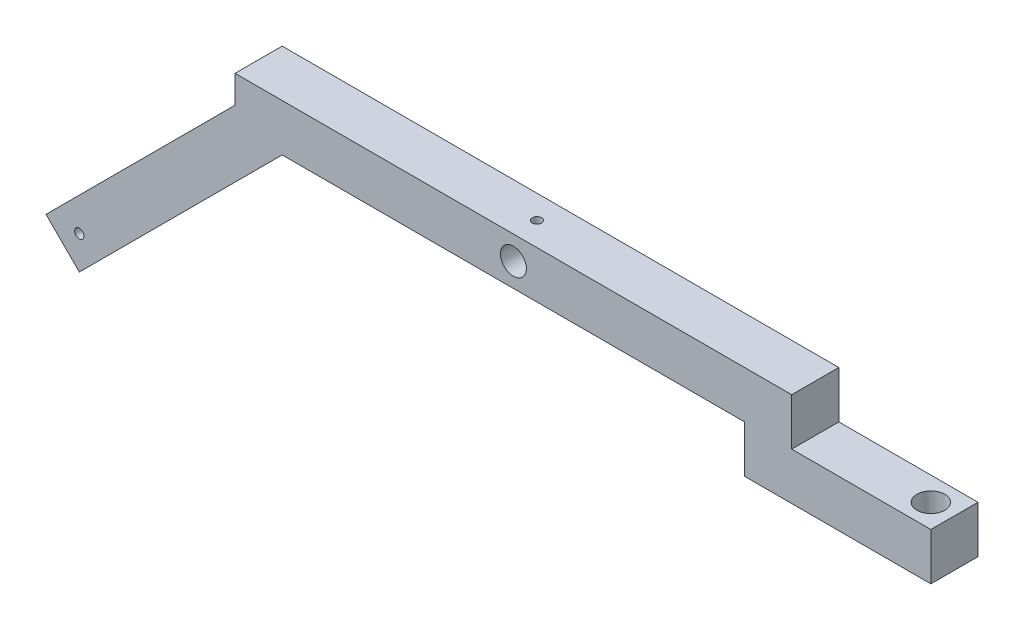
ISO-10303-21;
HEADER;
FILE_DESCRIPTION(('STEP AP214'),'2;1');
FILE_NAME('part.step','',(''),(''),'','','');
FILE_SCHEMA(('AUTOMOTIVE_DESIGN { 1 0 10303 214 1 1 1 1 }'));
ENDSEC;
DATA;
#1=APPLICATION_CONTEXT('core data for automotive mechanical design processes');
#2=APPLICATION_PROTOCOL_DEFINITION('international standard','automotive_design',2000,#1);
#3=PRODUCT_CONTEXT('',#1,'mechanical');
#4=PRODUCT('Part','Part','',(#3));
#5=PRODUCT_RELATED_PRODUCT_CATEGORY('part','',(#4));
#6=PRODUCT_DEFINITION_FORMATION('','',#4);
#7=PRODUCT_DEFINITION_CONTEXT('part definition',#1,'design');
#8=PRODUCT_DEFINITION('design','',#6,#7);
#9=PRODUCT_DEFINITION_SHAPE('','',#8);
#10=(LENGTH_UNIT() NAMED_UNIT(*) SI_UNIT(.MILLI.,.METRE.));
#11=(NAMED_UNIT(*) PLANE_ANGLE_UNIT() SI_UNIT($,.RADIAN.));
#12=(NAMED_UNIT(*) SI_UNIT($,.STERADIAN.) SOLID_ANGLE_UNIT());
#13=UNCERTAINTY_MEASURE_WITH_UNIT(LENGTH_MEASURE(1.E-05),#10,'distance_accuracy_value','');
#14=(GEOMETRIC_REPRESENTATION_CONTEXT(3) GLOBAL_UNCERTAINTY_ASSIGNED_CONTEXT((#13)) GLOBAL_UNIT_ASSIGNED_CONTEXT((#10,
#11,#12)) REPRESENTATION_CONTEXT('',''));
#15=CARTESIAN_POINT('',(0.,0.,0.));
#16=DIRECTION('',(0.,0.,1.));
#17=DIRECTION('',(1.,0.,0.));
#18=AXIS2_PLACEMENT_3D('',#15,#16,#17);
#19=CARTESIAN_POINT('',(-100.,107.7,0.));
#20=DIRECTION('',(0.,-1.,0.));
#21=DIRECTION('',(0.,0.,-1.));
#22=AXIS2_PLACEMENT_3D('',#19,#20,#21);
#23=PLANE('',#22);
#24=CARTESIAN_POINT('',(50.,107.7,152.7));
#25=DIRECTION('',(0.,1.,0.));
#26=DIRECTION('',(0.,0.,1.));
#27=AXIS2_PLACEMENT_3D('',#24,#25,#26);
#28=CIRCLE('',#27,2.5);
#29=CARTESIAN_POINT('',(50.,107.7,155.2));
#30=VERTEX_POINT('',#29);
#31=EDGE_CURVE('E219',#30,#30,#28,.T.);
#32=ORIENTED_EDGE('',*,*,#31,.T.);
#33=EDGE_LOOP('',(#32));
#34=FACE_BOUND('',#33,.T.);
#35=DIRECTION('',(1.,0.,0.));
#36=VECTOR('',#35,1.);
#37=CARTESIAN_POINT('',(-100.,107.7,140.));
#38=LINE('',#37,#36);
#39=CARTESIAN_POINT('',(-74.6,107.7,140.));
#40=VERTEX_POINT('',#39);
#41=CARTESIAN_POINT('',(174.6,107.7,140.));
#42=VERTEX_POINT('',#41);
#43=EDGE_CURVE('E256',#40,#42,#38,.T.);
#44=ORIENTED_EDGE('',*,*,#43,.T.);
#45=DIRECTION('',(0.,0.,-1.));
#46=VECTOR('',#45,1.);
#47=CARTESIAN_POINT('',(174.6,107.7,165.4));
#48=LINE('',#47,#46);
#49=CARTESIAN_POINT('',(174.6,107.7,165.4));
#50=VERTEX_POINT('',#49);
#51=EDGE_CURVE('E139',#50,#42,#48,.T.);
#52=ORIENTED_EDGE('',*,*,#51,.F.);
#53=DIRECTION('',(1.,0.,0.));
#54=VECTOR('',#53,1.);
#55=CARTESIAN_POINT('',(-100.,107.7,165.4));
#56=LINE('',#55,#54);
#57=CARTESIAN_POINT('',(-74.6,107.7,165.4));
#58=VERTEX_POINT('',#57);
#59=EDGE_CURVE('E51',#58,#50,#56,.T.);
#60=ORIENTED_EDGE('',*,*,#59,.F.);
#61=DIRECTION('',(0.,0.,1.));
#62=VECTOR('',#61,1.);
#63=CARTESIAN_POINT('',(-74.6,107.7,140.));
#64=LINE('',#63,#62);
#65=EDGE_CURVE('E190',#40,#58,#64,.T.);
#66=ORIENTED_EDGE('',*,*,#65,.F.);
#67=EDGE_LOOP('',(#44,#52,#60,#66));
#68=FACE_BOUND('',#67,.T.);
#69=ADVANCED_FACE('F42',(#34,#68),#23,.T.);
#70=CARTESIAN_POINT('',(-100.,0.,0.));
#71=DIRECTION('',(1.,0.,0.));
#72=DIRECTION('',(0.,0.,-1.));
#73=AXIS2_PLACEMENT_3D('',#70,#71,#72);
#74=PLANE('',#73);
#75=DIRECTION('',(0.,0.,-1.));
#76=VECTOR('',#75,1.);
#77=CARTESIAN_POINT('',(-100.,118.221024484276,0.));
#78=LINE('',#77,#76);
#79=CARTESIAN_POINT('',(-100.,118.221024484276,165.4));
#80=VERTEX_POINT('',#79);
#81=CARTESIAN_POINT('',(-100.,118.221024484276,140.));
#82=VERTEX_POINT('',#81);
#83=EDGE_CURVE('E11',#80,#82,#78,.T.);
#84=ORIENTED_EDGE('',*,*,#83,.F.);
#85=DIRECTION('',(0.,1.,0.));
#86=VECTOR('',#85,1.);
#87=CARTESIAN_POINT('',(-100.,0.,165.4));
#88=LINE('',#87,#86);
#89=CARTESIAN_POINT('',(-100.,133.1,165.4));
#90=VERTEX_POINT('',#89);
#91=EDGE_CURVE('E253',#80,#90,#88,.T.);
#92=ORIENTED_EDGE('',*,*,#91,.T.);
#93=DIRECTION('',(0.,0.,-1.));
#94=VECTOR('',#93,1.);
#95=CARTESIAN_POINT('',(-100.,133.1,0.));
#96=LINE('',#95,#94);
#97=CARTESIAN_POINT('',(-100.,133.1,140.));
#98=VERTEX_POINT('',#97);
#99=EDGE_CURVE('E249',#90,#98,#96,.T.);
#100=ORIENTED_EDGE('',*,*,#99,.T.);
#101=DIRECTION('',(0.,1.,0.));
#102=VECTOR('',#101,1.);
#103=CARTESIAN_POINT('',(-100.,0.,140.));
#104=LINE('',#103,#102);
#105=EDGE_CURVE('E246',#82,#98,#104,.T.);
#106=ORIENTED_EDGE('',*,*,#105,.F.);
#107=EDGE_LOOP('',(#84,#92,#100,#106));
#108=FACE_BOUND('',#107,.T.);
#109=ADVANCED_FACE('F328',(#108),#74,.F.);
#110=CARTESIAN_POINT('',(-100.,0.,165.4));
#111=DIRECTION('',(0.,0.,-1.));
#112=DIRECTION('',(-1.,0.,0.));
#113=AXIS2_PLACEMENT_3D('',#110,#111,#112);
#114=PLANE('',#113);
#115=CARTESIAN_POINT('',(-183.91870837144,16.3418038706977,165.4));
#116=DIRECTION('',(0.,0.,-1.));
#117=DIRECTION('',(-1.,0.,0.));
#118=AXIS2_PLACEMENT_3D('',#115,#116,#117);
#119=CIRCLE('',#118,2.5);
#120=CARTESIAN_POINT('',(-186.41870837144,16.3418038706977,165.4));
#121=VERTEX_POINT('',#120);
#122=EDGE_CURVE('E186',#121,#121,#119,.T.);
#123=ORIENTED_EDGE('',*,*,#122,.T.);
#124=EDGE_LOOP('',(#123));
#125=FACE_BOUND('',#124,.T.);
#126=DIRECTION('',(0.707106781186547,0.707106781186548,0.));
#127=VECTOR('',#126,1.);
#128=CARTESIAN_POINT('',(-183.91870837144,-1.61870837144028,165.4));
#129=LINE('',#128,#127);
#130=CARTESIAN_POINT('',(-183.91870837144,-1.61870837144028,165.4));
#131=VERTEX_POINT('',#130);
#132=EDGE_CURVE('E215',#131,#58,#129,.T.);
#133=ORIENTED_EDGE('',*,*,#132,.T.);
#134=ORIENTED_EDGE('',*,*,#59,.T.);
#135=DIRECTION('',(0.,1.,0.));
#136=VECTOR('',#135,1.);
#137=CARTESIAN_POINT('',(174.6,82.3,165.4));
#138=LINE('',#137,#136);
#139=CARTESIAN_POINT('',(174.6,82.3,165.4));
#140=VERTEX_POINT('',#139);
#141=EDGE_CURVE('E134',#140,#50,#138,.T.);
#142=ORIENTED_EDGE('',*,*,#141,.F.);
#143=DIRECTION('',(-1.,0.,0.));
#144=VECTOR('',#143,1.);
#145=CARTESIAN_POINT('',(200.,82.3,165.4));
#146=LINE('',#145,#144);
#147=CARTESIAN_POINT('',(275.,82.3,165.4));
#148=VERTEX_POINT('',#147);
#149=EDGE_CURVE('E126',#148,#140,#146,.T.);
#150=ORIENTED_EDGE('',*,*,#149,.F.);
#151=DIRECTION('',(0.,-1.,0.));
#152=VECTOR('',#151,1.);
#153=CARTESIAN_POINT('',(275.,82.3,165.4));
#154=LINE('',#153,#152);
#155=CARTESIAN_POINT('',(275.,107.7,165.4));
#156=VERTEX_POINT('',#155);
#157=EDGE_CURVE('E132',#156,#148,#154,.T.);
#158=ORIENTED_EDGE('',*,*,#157,.F.);
#159=DIRECTION('',(-1.,0.,0.));
#160=VECTOR('',#159,1.);
#161=CARTESIAN_POINT('',(275.,107.7,165.4));
#162=LINE('',#161,#160);
#163=CARTESIAN_POINT('',(200.,107.7,165.4));
#164=VERTEX_POINT('',#163);
#165=EDGE_CURVE('E166',#156,#164,#162,.T.);
#166=ORIENTED_EDGE('',*,*,#165,.T.);
#167=DIRECTION('',(0.,1.,0.));
#168=VECTOR('',#167,1.);
#169=CARTESIAN_POINT('',(200.,0.,165.4));
#170=LINE('',#169,#168);
#171=CARTESIAN_POINT('',(200.,133.1,165.4));
#172=VERTEX_POINT('',#171);
#173=EDGE_CURVE('E243',#164,#172,#170,.T.);
#174=ORIENTED_EDGE('',*,*,#173,.T.);
#175=DIRECTION('',(1.,0.,0.));
#176=VECTOR('',#175,1.);
#177=CARTESIAN_POINT('',(-100.,133.1,165.4));
#178=LINE('',#177,#176);
#179=EDGE_CURVE('E259',#90,#172,#178,.T.);
#180=ORIENTED_EDGE('',*,*,#179,.F.);
#181=ORIENTED_EDGE('',*,*,#91,.F.);
#182=DIRECTION('',(0.707106781186547,0.707106781186548,0.));
#183=VECTOR('',#182,1.);
#184=CARTESIAN_POINT('',(-201.879220613578,16.3418038706977,165.4));
#185=LINE('',#184,#183);
#186=CARTESIAN_POINT('',(-201.879220613578,16.3418038706977,165.4));
#187=VERTEX_POINT('',#186);
#188=EDGE_CURVE('E212',#187,#80,#185,.T.);
#189=ORIENTED_EDGE('',*,*,#188,.F.);
#190=DIRECTION('',(-0.707106781186547,0.707106781186548,0.));
#191=VECTOR('',#190,1.);
#192=CARTESIAN_POINT('',(-183.91870837144,-1.61870837144028,165.4));
#193=LINE('',#192,#191);
#194=EDGE_CURVE('E195',#131,#187,#193,.T.);
#195=ORIENTED_EDGE('',*,*,#194,.F.);
#196=EDGE_LOOP('',(#133,#134,#142,#150,#158,#166,#174,#180,#181,#189,#195));
#197=FACE_BOUND('',#196,.T.);
#198=CARTESIAN_POINT('',(49.9999999999997,120.4,165.4));
#199=DIRECTION('',(0.,0.,1.));
#200=DIRECTION('',(1.,0.,0.));
#201=AXIS2_PLACEMENT_3D('',#198,#199,#200);
#202=CIRCLE('',#201,7.);
#203=CARTESIAN_POINT('',(56.9999999999997,120.4,165.4));
#204=VERTEX_POINT('',#203);
#205=EDGE_CURVE('E227',#204,#204,#202,.T.);
#206=ORIENTED_EDGE('',*,*,#205,.F.);
#207=EDGE_LOOP('',(#206));
#208=FACE_BOUND('',#207,.T.);
#209=ADVANCED_FACE('F128',(#125,#197,#208),#114,.F.);
#210=CARTESIAN_POINT('',(-100.,133.1,0.));
#211=DIRECTION('',(0.,-1.,0.));
#212=DIRECTION('',(0.,0.,-1.));
#213=AXIS2_PLACEMENT_3D('',#210,#211,#212);
#214=PLANE('',#213);
#215=CARTESIAN_POINT('',(50.,133.1,152.7));
#216=DIRECTION('',(0.,1.,0.));
#217=DIRECTION('',(0.,0.,1.));
#218=AXIS2_PLACEMENT_3D('',#215,#216,#217);
#219=CIRCLE('',#218,2.5);
#220=CARTESIAN_POINT('',(50.,133.1,155.2));
#221=VERTEX_POINT('',#220);
#222=EDGE_CURVE('E218',#221,#221,#219,.T.);
#223=ORIENTED_EDGE('',*,*,#222,.F.);
#224=EDGE_LOOP('',(#223));
#225=FACE_BOUND('',#224,.T.);
#226=ORIENTED_EDGE('',*,*,#179,.T.);
#227=DIRECTION('',(0.,0.,-1.));
#228=VECTOR('',#227,1.);
#229=CARTESIAN_POINT('',(200.,133.1,0.));
#230=LINE('',#229,#228);
#231=CARTESIAN_POINT('',(200.,133.1,140.));
#232=VERTEX_POINT('',#231);
#233=EDGE_CURVE('E239',#172,#232,#230,.T.);
#234=ORIENTED_EDGE('',*,*,#233,.T.);
#235=DIRECTION('',(1.,0.,0.));
#236=VECTOR('',#235,1.);
#237=CARTESIAN_POINT('',(-100.,133.1,140.));
#238=LINE('',#237,#236);
#239=EDGE_CURVE('E263',#98,#232,#238,.T.);
#240=ORIENTED_EDGE('',*,*,#239,.F.);
#241=ORIENTED_EDGE('',*,*,#99,.F.);
#242=EDGE_LOOP('',(#226,#234,#240,#241));
#243=FACE_BOUND('',#242,.T.);
#244=ADVANCED_FACE('F353',(#225,#243),#214,.F.);
#245=CARTESIAN_POINT('',(-100.,0.,140.));
#246=DIRECTION('',(0.,0.,-1.));
#247=DIRECTION('',(-1.,0.,0.));
#248=AXIS2_PLACEMENT_3D('',#245,#246,#247);
#249=PLANE('',#248);
#250=CARTESIAN_POINT('',(-183.91870837144,16.3418038706977,140.));
#251=DIRECTION('',(0.,0.,-1.));
#252=DIRECTION('',(-1.,0.,0.));
#253=AXIS2_PLACEMENT_3D('',#250,#251,#252);
#254=CIRCLE('',#253,2.5);
#255=CARTESIAN_POINT('',(-186.41870837144,16.3418038706977,140.));
#256=VERTEX_POINT('',#255);
#257=EDGE_CURVE('E45',#256,#256,#254,.T.);
#258=ORIENTED_EDGE('',*,*,#257,.F.);
#259=EDGE_LOOP('',(#258));
#260=FACE_BOUND('',#259,.T.);
#261=ORIENTED_EDGE('',*,*,#43,.F.);
#262=DIRECTION('',(0.707106781186547,0.707106781186548,0.));
#263=VECTOR('',#262,1.);
#264=CARTESIAN_POINT('',(-183.91870837144,-1.61870837144028,140.));
#265=LINE('',#264,#263);
#266=CARTESIAN_POINT('',(-183.91870837144,-1.61870837144028,140.));
#267=VERTEX_POINT('',#266);
#268=EDGE_CURVE('E204',#267,#40,#265,.T.);
#269=ORIENTED_EDGE('',*,*,#268,.F.);
#270=DIRECTION('',(0.707106781186547,-0.707106781186548,0.));
#271=VECTOR('',#270,1.);
#272=CARTESIAN_POINT('',(-183.91870837144,-1.61870837144028,140.));
#273=LINE('',#272,#271);
#274=CARTESIAN_POINT('',(-201.879220613578,16.3418038706977,140.));
#275=VERTEX_POINT('',#274);
#276=EDGE_CURVE('E201',#275,#267,#273,.T.);
#277=ORIENTED_EDGE('',*,*,#276,.F.);
#278=DIRECTION('',(0.707106781186547,0.707106781186548,0.));
#279=VECTOR('',#278,1.);
#280=CARTESIAN_POINT('',(-201.879220613578,16.3418038706977,140.));
#281=LINE('',#280,#279);
#282=EDGE_CURVE('E66',#275,#82,#281,.T.);
#283=ORIENTED_EDGE('',*,*,#282,.T.);
#284=ORIENTED_EDGE('',*,*,#105,.T.);
#285=ORIENTED_EDGE('',*,*,#239,.T.);
#286=DIRECTION('',(0.,1.,0.));
#287=VECTOR('',#286,1.);
#288=CARTESIAN_POINT('',(200.,0.,140.));
#289=LINE('',#288,#287);
#290=CARTESIAN_POINT('',(200.,107.7,140.));
#291=VERTEX_POINT('',#290);
#292=EDGE_CURVE('E231',#291,#232,#289,.T.);
#293=ORIENTED_EDGE('',*,*,#292,.F.);
#294=DIRECTION('',(-1.,0.,0.));
#295=VECTOR('',#294,1.);
#296=CARTESIAN_POINT('',(275.,107.7,140.));
#297=LINE('',#296,#295);
#298=CARTESIAN_POINT('',(275.,107.7,140.));
#299=VERTEX_POINT('',#298);
#300=EDGE_CURVE('E170',#299,#291,#297,.T.);
#301=ORIENTED_EDGE('',*,*,#300,.F.);
#302=DIRECTION('',(0.,1.,0.));
#303=VECTOR('',#302,1.);
#304=CARTESIAN_POINT('',(275.,82.3,140.));
#305=LINE('',#304,#303);
#306=CARTESIAN_POINT('',(275.,82.3,140.));
#307=VERTEX_POINT('',#306);
#308=EDGE_CURVE('E149',#307,#299,#305,.T.);
#309=ORIENTED_EDGE('',*,*,#308,.F.);
#310=DIRECTION('',(1.,0.,0.));
#311=VECTOR('',#310,1.);
#312=CARTESIAN_POINT('',(200.,82.3,140.));
#313=LINE('',#312,#311);
#314=CARTESIAN_POINT('',(174.6,82.3,140.));
#315=VERTEX_POINT('',#314);
#316=EDGE_CURVE('E145',#315,#307,#313,.T.);
#317=ORIENTED_EDGE('',*,*,#316,.F.);
#318=DIRECTION('',(0.,1.,0.));
#319=VECTOR('',#318,1.);
#320=CARTESIAN_POINT('',(174.6,82.3,140.));
#321=LINE('',#320,#319);
#322=EDGE_CURVE('E178',#315,#42,#321,.T.);
#323=ORIENTED_EDGE('',*,*,#322,.T.);
#324=EDGE_LOOP('',(#261,#269,#277,#283,#284,#285,#293,#301,#309,#317,#323));
#325=FACE_BOUND('',#324,.T.);
#326=CARTESIAN_POINT('',(49.9999999999997,120.4,140.));
#327=DIRECTION('',(0.,0.,-1.));
#328=DIRECTION('',(-1.,0.,0.));
#329=AXIS2_PLACEMENT_3D('',#326,#327,#328);
#330=CIRCLE('',#329,7.);
#331=CARTESIAN_POINT('',(42.9999999999997,120.4,140.));
#332=VERTEX_POINT('',#331);
#333=EDGE_CURVE('E232',#332,#332,#330,.F.);
#334=ORIENTED_EDGE('',*,*,#333,.T.);
#335=EDGE_LOOP('',(#334));
#336=FACE_BOUND('',#335,.T.);
#337=ADVANCED_FACE('F342',(#260,#325,#336),#249,.T.);
#338=CARTESIAN_POINT('',(200.,0.,0.));
#339=DIRECTION('',(1.,0.,0.));
#340=DIRECTION('',(0.,0.,-1.));
#341=AXIS2_PLACEMENT_3D('',#338,#339,#340);
#342=PLANE('',#341);
#343=DIRECTION('',(0.,0.,1.));
#344=VECTOR('',#343,1.);
#345=CARTESIAN_POINT('',(200.,107.7,165.4));
#346=LINE('',#345,#344);
#347=EDGE_CURVE('E58',#291,#164,#346,.T.);
#348=ORIENTED_EDGE('',*,*,#347,.F.);
#349=ORIENTED_EDGE('',*,*,#292,.T.);
#350=ORIENTED_EDGE('',*,*,#233,.F.);
#351=ORIENTED_EDGE('',*,*,#173,.F.);
#352=EDGE_LOOP('',(#348,#349,#350,#351));
#353=FACE_BOUND('',#352,.T.);
#354=ADVANCED_FACE('F355',(#353),#342,.T.);
#355=CARTESIAN_POINT('',(49.9999999999997,120.4,-173.501));
#356=DIRECTION('',(0.,0.,1.));
#357=DIRECTION('',(1.,0.,0.));
#358=AXIS2_PLACEMENT_3D('',#355,#356,#357);
#359=CYLINDRICAL_SURFACE('',#358,7.);
#360=CARTESIAN_POINT('',(50.,113.4,155.2));
#361=CARTESIAN_POINT('',(49.8641602394813,113.39999797047,155.200002824042));
#362=CARTESIAN_POINT('',(49.7283405700525,113.403989433964,155.188893242767));
#363=CARTESIAN_POINT('',(49.4607351033931,113.419515950514,155.144908712808));
#364=CARTESIAN_POINT('',(49.3289491523854,113.431050715622,155.112034594935));
#365=CARTESIAN_POINT('',(49.0733078833257,113.46041890189,155.025814858733));
#366=CARTESIAN_POINT('',(48.9494386285408,113.478240872756,154.97250644028));
#367=CARTESIAN_POINT('',(48.712404147016,113.518389219676,154.847111280632));
#368=CARTESIAN_POINT('',(48.5992414935993,113.5407166746,154.775020040551));
#369=CARTESIAN_POINT('',(48.3824119719465,113.588526225702,154.611156867884));
#370=CARTESIAN_POINT('',(48.2792198432715,113.614091725549,154.518781268995));
#371=CARTESIAN_POINT('',(48.0894180067757,113.665064774637,154.31825363621));
#372=CARTESIAN_POINT('',(48.0028127129866,113.690472280098,154.210097416284));
#373=CARTESIAN_POINT('',(47.8457626443816,113.73919929831,153.976602207224));
#374=CARTESIAN_POINT('',(47.7759647020517,113.762418922382,153.850805256484));
#375=CARTESIAN_POINT('',(47.6587242777,113.802856475485,153.588296335296));
#376=CARTESIAN_POINT('',(47.6112738076845,113.820076548452,153.451588285432));
#377=CARTESIAN_POINT('',(47.5419086955147,113.845679617779,153.176577163798));
#378=CARTESIAN_POINT('',(47.5190948059267,113.85437266621,153.038530693057));
#379=CARTESIAN_POINT('',(47.4968384777252,113.862849381202,152.760316368176));
#380=CARTESIAN_POINT('',(47.4973875039403,113.862636301439,152.620149307458));
#381=CARTESIAN_POINT('',(47.5211492102767,113.853594117028,152.349644344948));
#382=CARTESIAN_POINT('',(47.5431483823635,113.845226363309,152.219181647));
#383=CARTESIAN_POINT('',(47.6071914894494,113.821579178256,151.963938472817));
#384=CARTESIAN_POINT('',(47.6492381626539,113.806298802769,151.839158775349));
#385=CARTESIAN_POINT('',(47.752904331559,113.770248295122,151.596226254214));
#386=CARTESIAN_POINT('',(47.8148580406674,113.749385522249,151.478230397341));
#387=CARTESIAN_POINT('',(47.9563472730931,113.704555303036,151.25394361335));
#388=CARTESIAN_POINT('',(48.0358884501977,113.680586859353,151.147656466693));
#389=CARTESIAN_POINT('',(48.2159685095289,113.630475015341,150.943040408629));
#390=CARTESIAN_POINT('',(48.3174866848456,113.604287765256,150.845582140751));
#391=CARTESIAN_POINT('',(48.5357381546509,113.553945263945,150.668828317165));
#392=CARTESIAN_POINT('',(48.6524733698063,113.52979026986,150.589535057701));
#393=CARTESIAN_POINT('',(48.8998996570783,113.48583001278,150.450519390061));
#394=CARTESIAN_POINT('',(49.0307508875748,113.466084678296,150.39106176011));
#395=CARTESIAN_POINT('',(49.3014765318728,113.433608323126,150.29528417584));
#396=CARTESIAN_POINT('',(49.4413473009462,113.420874488744,150.258954939237));
#397=CARTESIAN_POINT('',(49.7187949081862,113.404337973679,150.21208084934));
#398=CARTESIAN_POINT('',(49.8561493868309,113.400128960009,150.200361869254));
#399=CARTESIAN_POINT('',(50.1309093715734,113.399877021093,150.19965487801));
#400=CARTESIAN_POINT('',(50.2683148622127,113.403832481435,150.210662373008));
#401=CARTESIAN_POINT('',(50.5343686989978,113.419196500048,150.254186137322));
#402=CARTESIAN_POINT('',(50.6631558480814,113.430345821806,150.285954755798));
#403=CARTESIAN_POINT('',(50.91349944403,113.458717542033,150.369136594736));
#404=CARTESIAN_POINT('',(51.0350549497002,113.475940729001,150.420552365829));
#405=CARTESIAN_POINT('',(51.271317908515,113.515342604267,150.543158853402));
#406=CARTESIAN_POINT('',(51.3857354629872,113.537647375377,150.614866480499));
#407=CARTESIAN_POINT('',(51.6012793689737,113.584716044862,150.775427495107));
#408=CARTESIAN_POINT('',(51.7024011406396,113.609480785466,150.864286764774));
#409=CARTESIAN_POINT('',(51.8940229205975,113.660339590396,151.062129632729));
#410=CARTESIAN_POINT('',(51.9836868190697,113.686435201337,151.17192471302));
#411=CARTESIAN_POINT('',(52.143455257816,113.735721240023,151.405541270004));
#412=CARTESIAN_POINT('',(52.2135588430956,113.75891152589,151.529363431129));
#413=CARTESIAN_POINT('',(52.3320868609421,113.799596670434,151.788064809236));
#414=CARTESIAN_POINT('',(52.3804881075604,113.817085432405,151.92295567051));
#415=CARTESIAN_POINT('',(52.4536141901675,113.843985579958,152.19976010072));
#416=CARTESIAN_POINT('',(52.4783518546378,113.853401341781,152.341669820662));
#417=CARTESIAN_POINT('',(52.5023625550686,113.862544035722,152.619520479373));
#418=CARTESIAN_POINT('',(52.5030442697818,113.862806932435,152.755323214424));
#419=CARTESIAN_POINT('',(52.4824703500887,113.854966805362,153.024997670655));
#420=CARTESIAN_POINT('',(52.4612164224421,113.846864432458,153.158869541248));
#421=CARTESIAN_POINT('',(52.398430076072,113.823632995722,153.417500585372));
#422=CARTESIAN_POINT('',(52.3574196100894,113.80868525751,153.542404099006));
#423=CARTESIAN_POINT('',(52.2567264433817,113.773536706849,153.783642681867));
#424=CARTESIAN_POINT('',(52.197039249569,113.753334630554,153.899975680944));
#425=CARTESIAN_POINT('',(52.0573031307191,113.708727690052,154.126925749952));
#426=CARTESIAN_POINT('',(51.9764037159518,113.684165996631,154.236988040863));
#427=CARTESIAN_POINT('',(51.7979086301193,113.634195886717,154.442427504661));
#428=CARTESIAN_POINT('',(51.7003079103359,113.608787216062,154.537800220351));
#429=CARTESIAN_POINT('',(51.4856625233953,113.558545543323,154.715721902817));
#430=CARTESIAN_POINT('',(51.3679175061671,113.533796329292,154.797453039791));
#431=CARTESIAN_POINT('',(51.1195113124947,113.488950755982,154.939907663838));
#432=CARTESIAN_POINT('',(50.988851114159,113.468854044737,155.000632740203));
#433=CARTESIAN_POINT('',(50.717646336525,113.435539938192,155.099140310309));
#434=CARTESIAN_POINT('',(50.5770625604678,113.422351780261,155.136825408163));
#435=CARTESIAN_POINT('',(50.2909768811348,113.404584577224,155.187248874639));
#436=CARTESIAN_POINT('',(50.1454769190978,113.400002173515,155.199996975606));
#437=CARTESIAN_POINT('',(50.,113.4,155.2));
#438=B_SPLINE_CURVE_WITH_KNOTS('',3,(#360,#361,#362,#363,#364,#365,#366,#367,#368,#369,#370,
#371,#372,#373,#374,#375,#376,#377,#378,#379,#380,#381,#382,#383,#384,#385,#386,#387,#388,#389,
#390,#391,#392,#393,#394,#395,#396,#397,#398,#399,#400,#401,#402,#403,#404,#405,#406,#407,#408,
#409,#410,#411,#412,#413,#414,#415,#416,#417,#418,#419,#420,#421,#422,#423,#424,#425,#426,#427,
#428,#429,#430,#431,#432,#433,#434,#435,#436,#437),.UNSPECIFIED.,.T.,.F.,(4,2,2,2,2,2,2,2,2,2,2,
2,2,2,2,2,2,2,2,2,2,2,2,2,2,2,2,2,2,2,2,2,2,2,2,2,2,2,4),(0.,0.406983217142948,
0.813950899519918,1.22018120425628,1.62650889940496,2.04714572459518,2.46789433314933,
2.90289606780331,3.33774219500346,3.75611562378721,4.17433620956449,4.57019246497944,
4.96610280426152,5.36904149669466,5.77210990935865,6.19956653135136,6.62707715847136,
7.06008524763623,7.49291944485569,7.90458529912079,8.31616976000821,8.71369326802823,
9.11126840085788,9.52005856953121,9.9289891826931,10.3593838463852,10.7897995195909,
11.2206739431307,11.6513146487841,12.0566930957309,12.4620400035307,12.8572208236401,
13.2524967861626,13.6670344525245,14.0816976535746,14.5159343578492,14.9501382011315,
15.3861650682913,15.8220217300551),.UNSPECIFIED.);
#439=CARTESIAN_POINT('',(50.,113.4,155.2));
#440=VERTEX_POINT('',#439);
#441=EDGE_CURVE('E236',#440,#440,#438,.T.);
#442=ORIENTED_EDGE('',*,*,#441,.T.);
#443=EDGE_LOOP('',(#442));
#444=FACE_BOUND('',#443,.T.);
#445=CARTESIAN_POINT('',(50.,127.4,155.2));
#446=CARTESIAN_POINT('',(50.1358397605187,127.40000202953,155.200002824042));
#447=CARTESIAN_POINT('',(50.2716594299475,127.396010566036,155.188893242767));
#448=CARTESIAN_POINT('',(50.5392648966069,127.380484049486,155.144908712808));
#449=CARTESIAN_POINT('',(50.6710508476146,127.368949284377,155.112034594935));
#450=CARTESIAN_POINT('',(50.9266921166743,127.33958109811,155.025814858733));
#451=CARTESIAN_POINT('',(51.0505613714592,127.321759127243,154.97250644028));
#452=CARTESIAN_POINT('',(51.287595852984,127.281610780323,154.847111280632));
#453=CARTESIAN_POINT('',(51.4007585064008,127.2592833254,154.775020040551));
#454=CARTESIAN_POINT('',(51.6175880280535,127.211473774297,154.611156867884));
#455=CARTESIAN_POINT('',(51.7207801567285,127.185908274451,154.518781268995));
#456=CARTESIAN_POINT('',(51.9105819932243,127.134935225363,154.31825363621));
#457=CARTESIAN_POINT('',(51.9971872870135,127.109527719902,154.210097416284));
#458=CARTESIAN_POINT('',(52.1542373556184,127.06080070169,153.976602207224));
#459=CARTESIAN_POINT('',(52.2240352979483,127.037581077618,153.850805256483));
#460=CARTESIAN_POINT('',(52.3412757223001,126.997143524515,153.588296335296));
#461=CARTESIAN_POINT('',(52.3887261923155,126.979923451548,153.451588285432));
#462=CARTESIAN_POINT('',(52.4580913044853,126.95432038222,153.176577163797));
#463=CARTESIAN_POINT('',(52.4809051940733,126.94562733379,153.038530693057));
#464=CARTESIAN_POINT('',(52.5031615222748,126.937150618798,152.760316368176));
#465=CARTESIAN_POINT('',(52.5026124960597,126.937363698561,152.620149307458));
#466=CARTESIAN_POINT('',(52.4788507897233,126.946405882972,152.349644344948));
#467=CARTESIAN_POINT('',(52.4568516176365,126.95477363669,152.219181647));
#468=CARTESIAN_POINT('',(52.3928085105506,126.978420821744,151.963938472817));
#469=CARTESIAN_POINT('',(52.3507618373461,126.993701197231,151.839158775349));
#470=CARTESIAN_POINT('',(52.247095668441,127.029751704878,151.596226254214));
#471=CARTESIAN_POINT('',(52.1851419593326,127.05061447775,151.478230397342));
#472=CARTESIAN_POINT('',(52.043652726907,127.095444696964,151.25394361335));
#473=CARTESIAN_POINT('',(51.9641115498023,127.119413140647,151.147656466693));
#474=CARTESIAN_POINT('',(51.7840314904711,127.169524984659,150.943040408629));
#475=CARTESIAN_POINT('',(51.6825133151544,127.195712234743,150.845582140751));
#476=CARTESIAN_POINT('',(51.4642618453491,127.246054736055,150.668828317165));
#477=CARTESIAN_POINT('',(51.3475266301937,127.27020973014,150.589535057701));
#478=CARTESIAN_POINT('',(51.1001003429218,127.31416998722,150.450519390061));
#479=CARTESIAN_POINT('',(50.9692491124252,127.333915321704,150.39106176011));
#480=CARTESIAN_POINT('',(50.6985234681273,127.366391676874,150.29528417584));
#481=CARTESIAN_POINT('',(50.5586526990538,127.379125511256,150.258954939237));
#482=CARTESIAN_POINT('',(50.2812050918138,127.395662026321,150.21208084934));
#483=CARTESIAN_POINT('',(50.1438506131691,127.399871039991,150.200361869254));
#484=CARTESIAN_POINT('',(49.8690906284266,127.400122978907,150.19965487801));
#485=CARTESIAN_POINT('',(49.7316851377873,127.396167518565,150.210662373008));
#486=CARTESIAN_POINT('',(49.4656313010022,127.380803499952,150.254186137322));
#487=CARTESIAN_POINT('',(49.3368441519186,127.369654178194,150.285954755798));
#488=CARTESIAN_POINT('',(49.08650055597,127.341282457967,150.369136594736));
#489=CARTESIAN_POINT('',(48.9649450502998,127.324059270999,150.420552365829));
#490=CARTESIAN_POINT('',(48.728682091485,127.284657395733,150.543158853402));
#491=CARTESIAN_POINT('',(48.6142645370128,127.262352624623,150.614866480499));
#492=CARTESIAN_POINT('',(48.3987206310263,127.215283955138,150.775427495107));
#493=CARTESIAN_POINT('',(48.2975988593604,127.190519214535,150.864286764774));
#494=CARTESIAN_POINT('',(48.1059770794025,127.139660409605,151.062129632729));
#495=CARTESIAN_POINT('',(48.0163131809303,127.113564798663,151.17192471302));
#496=CARTESIAN_POINT('',(47.856544742184,127.064278759977,151.405541270004));
#497=CARTESIAN_POINT('',(47.7864411569044,127.04108847411,151.529363431129));
#498=CARTESIAN_POINT('',(47.6679131390579,127.000403329566,151.788064809236));
#499=CARTESIAN_POINT('',(47.6195118924396,126.982914567596,151.92295567051));
#500=CARTESIAN_POINT('',(47.5463858098325,126.956014420043,152.19976010072));
#501=CARTESIAN_POINT('',(47.5216481453622,126.946598658219,152.341669820662));
#502=CARTESIAN_POINT('',(47.4976374449314,126.937455964278,152.619520479373));
#503=CARTESIAN_POINT('',(47.4969557302182,126.937193067565,152.755323214424));
#504=CARTESIAN_POINT('',(47.5175296499113,126.945033194638,153.024997670655));
#505=CARTESIAN_POINT('',(47.5387835775579,126.953135567542,153.158869541248));
#506=CARTESIAN_POINT('',(47.6015699239281,126.976367004278,153.417500585372));
#507=CARTESIAN_POINT('',(47.6425803899107,126.99131474249,153.542404099006));
#508=CARTESIAN_POINT('',(47.7432735566183,127.026463293151,153.783642681867));
#509=CARTESIAN_POINT('',(47.8029607504311,127.046665369447,153.899975680944));
#510=CARTESIAN_POINT('',(47.942696869281,127.091272309948,154.126925749952));
#511=CARTESIAN_POINT('',(48.0235962840483,127.115834003369,154.236988040863));
#512=CARTESIAN_POINT('',(48.2020913698808,127.165804113283,154.442427504661));
#513=CARTESIAN_POINT('',(48.2996920896642,127.191212783939,154.537800220351));
#514=CARTESIAN_POINT('',(48.5143374766048,127.241454456677,154.715721902817));
#515=CARTESIAN_POINT('',(48.632082493833,127.266203670708,154.797453039791));
#516=CARTESIAN_POINT('',(48.8804886875054,127.311049244019,154.939907663838));
#517=CARTESIAN_POINT('',(49.0111488858411,127.331145955263,155.000632740203));
#518=CARTESIAN_POINT('',(49.2823536634751,127.364460061808,155.099140310309));
#519=CARTESIAN_POINT('',(49.4229374395322,127.377648219739,155.136825408163));
#520=CARTESIAN_POINT('',(49.7090231188652,127.395415422776,155.187248874639));
#521=CARTESIAN_POINT('',(49.8545230809022,127.399997826485,155.199996975606));
#522=CARTESIAN_POINT('',(50.,127.4,155.2));
#523=B_SPLINE_CURVE_WITH_KNOTS('',3,(#445,#446,#447,#448,#449,#450,#451,#452,#453,#454,#455,
#456,#457,#458,#459,#460,#461,#462,#463,#464,#465,#466,#467,#468,#469,#470,#471,#472,#473,#474,
#475,#476,#477,#478,#479,#480,#481,#482,#483,#484,#485,#486,#487,#488,#489,#490,#491,#492,#493,
#494,#495,#496,#497,#498,#499,#500,#501,#502,#503,#504,#505,#506,#507,#508,#509,#510,#511,#512,
#513,#514,#515,#516,#517,#518,#519,#520,#521,#522),.UNSPECIFIED.,.T.,.F.,(4,2,2,2,2,2,2,2,2,2,2,
2,2,2,2,2,2,2,2,2,2,2,2,2,2,2,2,2,2,2,2,2,2,2,2,2,2,2,4),(0.,0.406983217142955,0.81395089951995,
1.22018120425632,1.626508899405,2.04714572459524,2.46789433314943,2.90289606780342,
3.33774219500357,3.75611562378738,4.17433620956457,4.57019246497947,4.96610280426155,
5.36904149669468,5.77210990935869,6.1995665313514,6.62707715847141,7.06008524763629,
7.49291944485576,7.90458529912084,8.3161697600083,8.71369326802831,9.11126840085796,
9.52005856953127,9.92898918269318,10.3593838463852,10.7897995195909,11.2206739431308,
11.6513146487842,12.0566930957309,12.4620400035307,12.8572208236402,13.2524967861626,
13.6670344525246,14.0816976535747,14.5159343578493,14.9501382011316,15.3861650682914,
15.8220217300551),.UNSPECIFIED.);
#524=CARTESIAN_POINT('',(50.,127.4,155.2));
#525=VERTEX_POINT('',#524);
#526=EDGE_CURVE('E223',#525,#525,#523,.T.);
#527=ORIENTED_EDGE('',*,*,#526,.T.);
#528=EDGE_LOOP('',(#527));
#529=FACE_BOUND('',#528,.T.);
#530=ORIENTED_EDGE('',*,*,#333,.F.);
#531=EDGE_LOOP('',(#530));
#532=FACE_BOUND('',#531,.T.);
#533=ORIENTED_EDGE('',*,*,#205,.T.);
#534=EDGE_LOOP('',(#533));
#535=FACE_BOUND('',#534,.T.);
#536=ADVANCED_FACE('F281',(#444,#529,#532,#535),#359,.F.);
#537=CARTESIAN_POINT('',(50.,107.7,152.7));
#538=DIRECTION('',(0.,1.,0.));
#539=DIRECTION('',(0.,0.,1.));
#540=AXIS2_PLACEMENT_3D('',#537,#538,#539);
#541=CYLINDRICAL_SURFACE('',#540,2.5);
#542=ORIENTED_EDGE('',*,*,#222,.T.);
#543=EDGE_LOOP('',(#542));
#544=FACE_BOUND('',#543,.T.);
#545=ORIENTED_EDGE('',*,*,#526,.F.);
#546=EDGE_LOOP('',(#545));
#547=FACE_BOUND('',#546,.T.);
#548=ADVANCED_FACE('F289',(#544,#547),#541,.F.);
#549=ORIENTED_EDGE('',*,*,#31,.F.);
#550=EDGE_LOOP('',(#549));
#551=FACE_BOUND('',#550,.T.);
#552=ORIENTED_EDGE('',*,*,#441,.F.);
#553=EDGE_LOOP('',(#552));
#554=FACE_BOUND('',#553,.T.);
#555=ADVANCED_FACE('F284',(#551,#554),#541,.F.);
#556=CARTESIAN_POINT('',(-201.879220613578,16.3418038706977,140.));
#557=DIRECTION('',(0.707106781186548,-0.707106781186547,0.));
#558=DIRECTION('',(0.707106781186547,0.707106781186548,0.));
#559=AXIS2_PLACEMENT_3D('',#556,#557,#558);
#560=PLANE('',#559);
#561=ORIENTED_EDGE('',*,*,#188,.T.);
#562=ORIENTED_EDGE('',*,*,#83,.T.);
#563=ORIENTED_EDGE('',*,*,#282,.F.);
#564=DIRECTION('',(0.,0.,-1.));
#565=VECTOR('',#564,1.);
#566=CARTESIAN_POINT('',(-201.879220613578,16.3418038706977,140.));
#567=LINE('',#566,#565);
#568=EDGE_CURVE('E198',#187,#275,#567,.T.);
#569=ORIENTED_EDGE('',*,*,#568,.F.);
#570=EDGE_LOOP('',(#561,#562,#563,#569));
#571=FACE_BOUND('',#570,.T.);
#572=ADVANCED_FACE('F288',(#571),#560,.F.);
#573=CARTESIAN_POINT('',(-183.91870837144,-1.61870837144028,140.));
#574=DIRECTION('',(-0.707106781186548,0.707106781186547,0.));
#575=DIRECTION('',(-0.707106781186547,-0.707106781186548,0.));
#576=AXIS2_PLACEMENT_3D('',#573,#574,#575);
#577=PLANE('',#576);
#578=ORIENTED_EDGE('',*,*,#65,.T.);
#579=ORIENTED_EDGE('',*,*,#132,.F.);
#580=DIRECTION('',(0.,0.,1.));
#581=VECTOR('',#580,1.);
#582=CARTESIAN_POINT('',(-183.91870837144,-1.61870837144028,140.));
#583=LINE('',#582,#581);
#584=EDGE_CURVE('E191',#267,#131,#583,.T.);
#585=ORIENTED_EDGE('',*,*,#584,.F.);
#586=ORIENTED_EDGE('',*,*,#268,.T.);
#587=EDGE_LOOP('',(#578,#579,#585,#586));
#588=FACE_BOUND('',#587,.T.);
#589=ADVANCED_FACE('F291',(#588),#577,.F.);
#590=CARTESIAN_POINT('',(-92.7687083714403,-92.7687083714404,0.));
#591=DIRECTION('',(-0.707106781186548,-0.707106781186547,0.));
#592=DIRECTION('',(0.707106781186547,-0.707106781186548,0.));
#593=AXIS2_PLACEMENT_3D('',#590,#591,#592);
#594=PLANE('',#593);
#595=ORIENTED_EDGE('',*,*,#584,.T.);
#596=ORIENTED_EDGE('',*,*,#194,.T.);
#597=ORIENTED_EDGE('',*,*,#568,.T.);
#598=ORIENTED_EDGE('',*,*,#276,.T.);
#599=EDGE_LOOP('',(#595,#596,#597,#598));
#600=FACE_BOUND('',#599,.T.);
#601=ADVANCED_FACE('F295',(#600),#594,.T.);
#602=CARTESIAN_POINT('',(-183.91870837144,16.3418038706977,138.));
#603=DIRECTION('',(0.,0.,1.));
#604=DIRECTION('',(1.,0.,0.));
#605=AXIS2_PLACEMENT_3D('',#602,#603,#604);
#606=CYLINDRICAL_SURFACE('',#605,2.5);
#607=ORIENTED_EDGE('',*,*,#257,.T.);
#608=EDGE_LOOP('',(#607));
#609=FACE_BOUND('',#608,.T.);
#610=ORIENTED_EDGE('',*,*,#122,.F.);
#611=EDGE_LOOP('',(#610));
#612=FACE_BOUND('',#611,.T.);
#613=ADVANCED_FACE('F302',(#609,#612),#606,.F.);
#614=CARTESIAN_POINT('',(174.6,82.3,165.4));
#615=DIRECTION('',(1.,0.,0.));
#616=DIRECTION('',(0.,0.,-1.));
#617=AXIS2_PLACEMENT_3D('',#614,#615,#616);
#618=PLANE('',#617);
#619=ORIENTED_EDGE('',*,*,#51,.T.);
#620=ORIENTED_EDGE('',*,*,#322,.F.);
#621=DIRECTION('',(0.,0.,-1.));
#622=VECTOR('',#621,1.);
#623=CARTESIAN_POINT('',(174.6,82.3,165.4));
#624=LINE('',#623,#622);
#625=EDGE_CURVE('E138',#140,#315,#624,.T.);
#626=ORIENTED_EDGE('',*,*,#625,.F.);
#627=ORIENTED_EDGE('',*,*,#141,.T.);
#628=EDGE_LOOP('',(#619,#620,#626,#627));
#629=FACE_BOUND('',#628,.T.);
#630=ADVANCED_FACE('F306',(#629),#618,.F.);
#631=CARTESIAN_POINT('',(0.,82.3,0.));
#632=DIRECTION('',(0.,1.,0.));
#633=DIRECTION('',(0.,0.,1.));
#634=AXIS2_PLACEMENT_3D('',#631,#632,#633);
#635=PLANE('',#634);
#636=CARTESIAN_POINT('',(262.3,82.3,152.7));
#637=DIRECTION('',(0.,1.,0.));
#638=DIRECTION('',(0.,0.,1.));
#639=AXIS2_PLACEMENT_3D('',#636,#637,#638);
#640=CIRCLE('',#639,7.50000000000001);
#641=CARTESIAN_POINT('',(262.3,82.3,160.2));
#642=VERTEX_POINT('',#641);
#643=EDGE_CURVE('E158',#642,#642,#640,.F.);
#644=ORIENTED_EDGE('',*,*,#643,.F.);
#645=EDGE_LOOP('',(#644));
#646=FACE_BOUND('',#645,.T.);
#647=ORIENTED_EDGE('',*,*,#316,.T.);
#648=DIRECTION('',(0.,0.,-1.));
#649=VECTOR('',#648,1.);
#650=CARTESIAN_POINT('',(275.,82.3,165.4));
#651=LINE('',#650,#649);
#652=EDGE_CURVE('E142',#148,#307,#651,.T.);
#653=ORIENTED_EDGE('',*,*,#652,.F.);
#654=ORIENTED_EDGE('',*,*,#149,.T.);
#655=ORIENTED_EDGE('',*,*,#625,.T.);
#656=EDGE_LOOP('',(#647,#653,#654,#655));
#657=FACE_BOUND('',#656,.T.);
#658=ADVANCED_FACE('F143',(#646,#657),#635,.F.);
#659=CARTESIAN_POINT('',(275.,107.7,165.4));
#660=DIRECTION('',(0.,-1.,0.));
#661=DIRECTION('',(0.,0.,-1.));
#662=AXIS2_PLACEMENT_3D('',#659,#660,#661);
#663=PLANE('',#662);
#664=CARTESIAN_POINT('',(262.3,107.7,152.7));
#665=DIRECTION('',(0.,1.,0.));
#666=DIRECTION('',(0.,0.,1.));
#667=AXIS2_PLACEMENT_3D('',#664,#665,#666);
#668=CIRCLE('',#667,7.50000000000001);
#669=CARTESIAN_POINT('',(262.3,107.7,160.2));
#670=VERTEX_POINT('',#669);
#671=EDGE_CURVE('E538',#670,#670,#668,.T.);
#672=ORIENTED_EDGE('',*,*,#671,.F.);
#673=EDGE_LOOP('',(#672));
#674=FACE_BOUND('',#673,.T.);
#675=ORIENTED_EDGE('',*,*,#347,.T.);
#676=ORIENTED_EDGE('',*,*,#165,.F.);
#677=DIRECTION('',(0.,0.,1.));
#678=VECTOR('',#677,1.);
#679=CARTESIAN_POINT('',(275.,107.7,165.4));
#680=LINE('',#679,#678);
#681=EDGE_CURVE('E153',#299,#156,#680,.T.);
#682=ORIENTED_EDGE('',*,*,#681,.F.);
#683=ORIENTED_EDGE('',*,*,#300,.T.);
#684=EDGE_LOOP('',(#675,#676,#682,#683));
#685=FACE_BOUND('',#684,.T.);
#686=ADVANCED_FACE('F313',(#674,#685),#663,.F.);
#687=CARTESIAN_POINT('',(275.,0.,0.));
#688=DIRECTION('',(-1.,0.,0.));
#689=DIRECTION('',(0.,0.,1.));
#690=AXIS2_PLACEMENT_3D('',#687,#688,#689);
#691=PLANE('',#690);
#692=ORIENTED_EDGE('',*,*,#157,.T.);
#693=ORIENTED_EDGE('',*,*,#652,.T.);
#694=ORIENTED_EDGE('',*,*,#308,.T.);
#695=ORIENTED_EDGE('',*,*,#681,.T.);
#696=EDGE_LOOP('',(#692,#693,#694,#695));
#697=FACE_BOUND('',#696,.T.);
#698=ADVANCED_FACE('F151',(#697),#691,.F.);
#699=CARTESIAN_POINT('',(262.3,-1.61970837144028,152.7));
#700=DIRECTION('',(0.,1.,0.));
#701=DIRECTION('',(0.,0.,1.));
#702=AXIS2_PLACEMENT_3D('',#699,#700,#701);
#703=CYLINDRICAL_SURFACE('',#702,7.50000000000001);
#704=ORIENTED_EDGE('',*,*,#671,.T.);
#705=EDGE_LOOP('',(#704));
#706=FACE_BOUND('',#705,.T.);
#707=ORIENTED_EDGE('',*,*,#643,.T.);
#708=EDGE_LOOP('',(#707));
#709=FACE_BOUND('',#708,.T.);
#710=ADVANCED_FACE('F320',(#706,#709),#703,.F.);
#711=CLOSED_SHELL('',(#69,#109,#209,#244,#337,#354,#536,#548,#555,#572,#589,#601,#613,#630,#658,
#686,#698,#710));
#712=MANIFOLD_SOLID_BREP('B2',#711);
#713=ADVANCED_BREP_SHAPE_REPRESENTATION('',(#18,#712),#14);
#714=SHAPE_DEFINITION_REPRESENTATION(#9,#713);
ENDSEC;
END-ISO-10303-21;
